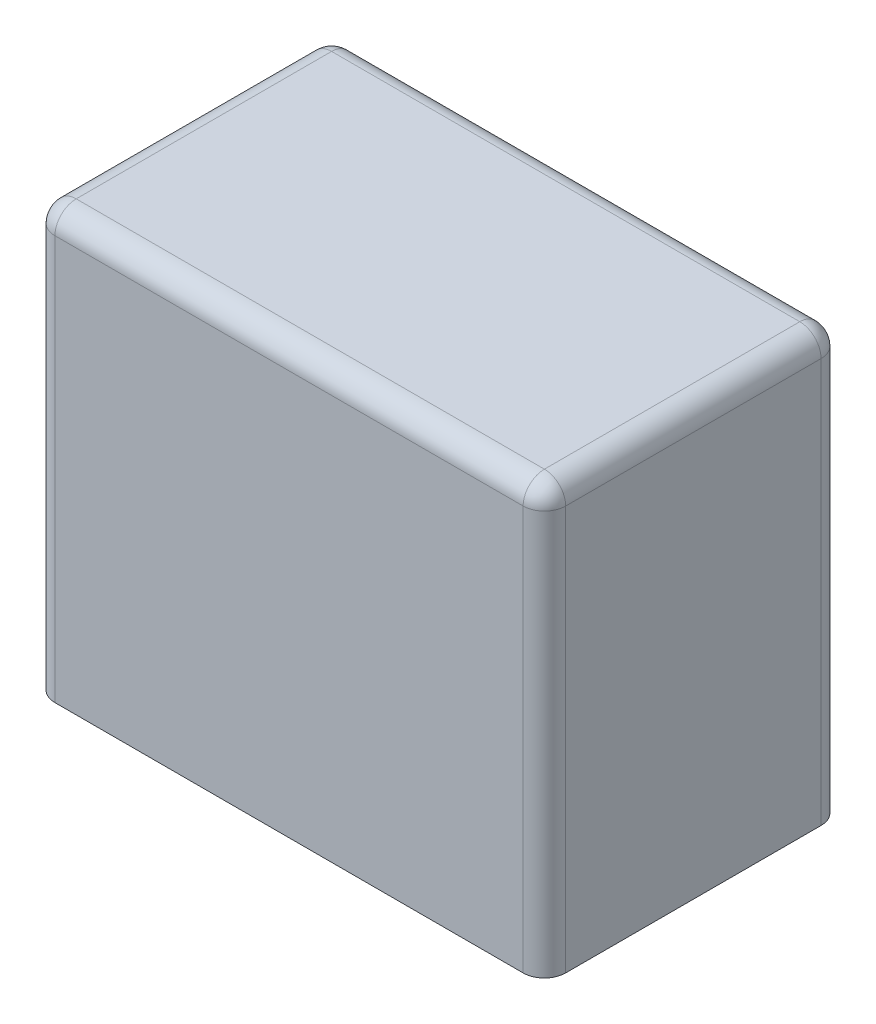
ISO-10303-21;
HEADER;
FILE_DESCRIPTION(('STEP AP214'),'2;1');
FILE_NAME('part.step','',(''),(''),'','','');
FILE_SCHEMA(('AUTOMOTIVE_DESIGN { 1 0 10303 214 1 1 1 1 }'));
ENDSEC;
DATA;
#1=APPLICATION_CONTEXT('core data for automotive mechanical design processes');
#2=APPLICATION_PROTOCOL_DEFINITION('international standard','automotive_design',2000,#1);
#3=PRODUCT_CONTEXT('',#1,'mechanical');
#4=PRODUCT('Part','Part','',(#3));
#5=PRODUCT_RELATED_PRODUCT_CATEGORY('part','',(#4));
#6=PRODUCT_DEFINITION_FORMATION('','',#4);
#7=PRODUCT_DEFINITION_CONTEXT('part definition',#1,'design');
#8=PRODUCT_DEFINITION('design','',#6,#7);
#9=PRODUCT_DEFINITION_SHAPE('','',#8);
#10=(LENGTH_UNIT() NAMED_UNIT(*) SI_UNIT(.MILLI.,.METRE.));
#11=(NAMED_UNIT(*) PLANE_ANGLE_UNIT() SI_UNIT($,.RADIAN.));
#12=(NAMED_UNIT(*) SI_UNIT($,.STERADIAN.) SOLID_ANGLE_UNIT());
#13=UNCERTAINTY_MEASURE_WITH_UNIT(LENGTH_MEASURE(1.E-05),#10,'distance_accuracy_value','');
#14=(GEOMETRIC_REPRESENTATION_CONTEXT(3) GLOBAL_UNCERTAINTY_ASSIGNED_CONTEXT((#13)) GLOBAL_UNIT_ASSIGNED_CONTEXT((#10,
#11,#12)) REPRESENTATION_CONTEXT('',''));
#15=CARTESIAN_POINT('',(0.,0.,0.));
#16=DIRECTION('',(0.,0.,1.));
#17=DIRECTION('',(1.,0.,0.));
#18=AXIS2_PLACEMENT_3D('',#15,#16,#17);
#19=CARTESIAN_POINT('',(12.,20.,7.));
#20=DIRECTION('',(-1.,0.,0.));
#21=DIRECTION('',(0.,0.,1.));
#22=AXIS2_PLACEMENT_3D('',#19,#20,#21);
#23=PLANE('',#22);
#24=DIRECTION('',(0.,0.,-1.));
#25=VECTOR('',#24,1.);
#26=CARTESIAN_POINT('',(12.,0.,7.));
#27=LINE('',#26,#25);
#28=CARTESIAN_POINT('',(12.,0.,6.));
#29=VERTEX_POINT('',#28);
#30=CARTESIAN_POINT('',(12.,0.,-6.));
#31=VERTEX_POINT('',#30);
#32=EDGE_CURVE('E208',#29,#31,#27,.T.);
#33=ORIENTED_EDGE('',*,*,#32,.T.);
#34=DIRECTION('',(0.,-1.,0.));
#35=VECTOR('',#34,1.);
#36=CARTESIAN_POINT('',(12.,20.,-6.));
#37=LINE('',#36,#35);
#38=CARTESIAN_POINT('',(12.,19.,-6.));
#39=VERTEX_POINT('',#38);
#40=EDGE_CURVE('E60',#31,#39,#37,.F.);
#41=ORIENTED_EDGE('',*,*,#40,.T.);
#42=DIRECTION('',(0.,0.,-1.));
#43=VECTOR('',#42,1.);
#44=CARTESIAN_POINT('',(12.,19.,7.));
#45=LINE('',#44,#43);
#46=CARTESIAN_POINT('',(12.,19.,6.));
#47=VERTEX_POINT('',#46);
#48=EDGE_CURVE('E65',#39,#47,#45,.F.);
#49=ORIENTED_EDGE('',*,*,#48,.T.);
#50=DIRECTION('',(0.,-1.,0.));
#51=VECTOR('',#50,1.);
#52=CARTESIAN_POINT('',(12.,20.,6.));
#53=LINE('',#52,#51);
#54=EDGE_CURVE('E177',#47,#29,#53,.T.);
#55=ORIENTED_EDGE('',*,*,#54,.T.);
#56=EDGE_LOOP('',(#33,#41,#49,#55));
#57=FACE_BOUND('',#56,.T.);
#58=ADVANCED_FACE('F43',(#57),#23,.F.);
#59=CARTESIAN_POINT('',(-12.,20.,-7.));
#60=DIRECTION('',(0.,0.,1.));
#61=DIRECTION('',(1.,0.,0.));
#62=AXIS2_PLACEMENT_3D('',#59,#60,#61);
#63=PLANE('',#62);
#64=DIRECTION('',(-1.,0.,0.));
#65=VECTOR('',#64,1.);
#66=CARTESIAN_POINT('',(-12.,0.,-7.));
#67=LINE('',#66,#65);
#68=CARTESIAN_POINT('',(11.,0.,-7.));
#69=VERTEX_POINT('',#68);
#70=CARTESIAN_POINT('',(-11.,0.,-7.));
#71=VERTEX_POINT('',#70);
#72=EDGE_CURVE('E210',#69,#71,#67,.T.);
#73=ORIENTED_EDGE('',*,*,#72,.T.);
#74=DIRECTION('',(0.,-1.,0.));
#75=VECTOR('',#74,1.);
#76=CARTESIAN_POINT('',(-11.,20.,-7.));
#77=LINE('',#76,#75);
#78=CARTESIAN_POINT('',(-11.,19.,-7.));
#79=VERTEX_POINT('',#78);
#80=EDGE_CURVE('E175',#71,#79,#77,.F.);
#81=ORIENTED_EDGE('',*,*,#80,.T.);
#82=DIRECTION('',(-1.,0.,0.));
#83=VECTOR('',#82,1.);
#84=CARTESIAN_POINT('',(-12.,19.,-7.));
#85=LINE('',#84,#83);
#86=CARTESIAN_POINT('',(11.,19.,-7.));
#87=VERTEX_POINT('',#86);
#88=EDGE_CURVE('E173',#79,#87,#85,.F.);
#89=ORIENTED_EDGE('',*,*,#88,.T.);
#90=DIRECTION('',(0.,-1.,0.));
#91=VECTOR('',#90,1.);
#92=CARTESIAN_POINT('',(11.,20.,-7.));
#93=LINE('',#92,#91);
#94=EDGE_CURVE('E171',#87,#69,#93,.T.);
#95=ORIENTED_EDGE('',*,*,#94,.T.);
#96=EDGE_LOOP('',(#73,#81,#89,#95));
#97=FACE_BOUND('',#96,.T.);
#98=ADVANCED_FACE('F263',(#97),#63,.F.);
#99=CARTESIAN_POINT('',(-12.,20.,7.));
#100=DIRECTION('',(1.,0.,0.));
#101=DIRECTION('',(0.,0.,-1.));
#102=AXIS2_PLACEMENT_3D('',#99,#100,#101);
#103=PLANE('',#102);
#104=DIRECTION('',(0.,0.,1.));
#105=VECTOR('',#104,1.);
#106=CARTESIAN_POINT('',(-12.,19.,7.));
#107=LINE('',#106,#105);
#108=CARTESIAN_POINT('',(-12.,19.,6.));
#109=VERTEX_POINT('',#108);
#110=CARTESIAN_POINT('',(-12.,19.,-6.));
#111=VERTEX_POINT('',#110);
#112=EDGE_CURVE('E167',#109,#111,#107,.F.);
#113=ORIENTED_EDGE('',*,*,#112,.T.);
#114=DIRECTION('',(0.,-1.,0.));
#115=VECTOR('',#114,1.);
#116=CARTESIAN_POINT('',(-12.,20.,-6.));
#117=LINE('',#116,#115);
#118=CARTESIAN_POINT('',(-12.,0.,-6.));
#119=VERTEX_POINT('',#118);
#120=EDGE_CURVE('E169',#111,#119,#117,.T.);
#121=ORIENTED_EDGE('',*,*,#120,.T.);
#122=DIRECTION('',(0.,0.,1.));
#123=VECTOR('',#122,1.);
#124=CARTESIAN_POINT('',(-12.,0.,7.));
#125=LINE('',#124,#123);
#126=CARTESIAN_POINT('',(-12.,0.,6.));
#127=VERTEX_POINT('',#126);
#128=EDGE_CURVE('E214',#119,#127,#125,.T.);
#129=ORIENTED_EDGE('',*,*,#128,.T.);
#130=DIRECTION('',(0.,-1.,0.));
#131=VECTOR('',#130,1.);
#132=CARTESIAN_POINT('',(-12.,20.,6.));
#133=LINE('',#132,#131);
#134=EDGE_CURVE('E165',#127,#109,#133,.F.);
#135=ORIENTED_EDGE('',*,*,#134,.T.);
#136=EDGE_LOOP('',(#113,#121,#129,#135));
#137=FACE_BOUND('',#136,.T.);
#138=ADVANCED_FACE('F268',(#137),#103,.F.);
#139=CARTESIAN_POINT('',(-12.,20.,7.));
#140=DIRECTION('',(0.,0.,-1.));
#141=DIRECTION('',(-1.,0.,0.));
#142=AXIS2_PLACEMENT_3D('',#139,#140,#141);
#143=PLANE('',#142);
#144=DIRECTION('',(1.,0.,0.));
#145=VECTOR('',#144,1.);
#146=CARTESIAN_POINT('',(-12.,0.,7.));
#147=LINE('',#146,#145);
#148=CARTESIAN_POINT('',(-11.,0.,7.));
#149=VERTEX_POINT('',#148);
#150=CARTESIAN_POINT('',(11.,0.,7.));
#151=VERTEX_POINT('',#150);
#152=EDGE_CURVE('E150',#149,#151,#147,.T.);
#153=ORIENTED_EDGE('',*,*,#152,.T.);
#154=DIRECTION('',(0.,-1.,0.));
#155=VECTOR('',#154,1.);
#156=CARTESIAN_POINT('',(11.,20.,7.));
#157=LINE('',#156,#155);
#158=CARTESIAN_POINT('',(11.,19.,7.));
#159=VERTEX_POINT('',#158);
#160=EDGE_CURVE('E163',#151,#159,#157,.F.);
#161=ORIENTED_EDGE('',*,*,#160,.T.);
#162=DIRECTION('',(1.,0.,0.));
#163=VECTOR('',#162,1.);
#164=CARTESIAN_POINT('',(-12.,19.,7.));
#165=LINE('',#164,#163);
#166=CARTESIAN_POINT('',(-11.,19.,7.));
#167=VERTEX_POINT('',#166);
#168=EDGE_CURVE('E128',#159,#167,#165,.F.);
#169=ORIENTED_EDGE('',*,*,#168,.T.);
#170=DIRECTION('',(0.,-1.,0.));
#171=VECTOR('',#170,1.);
#172=CARTESIAN_POINT('',(-11.,20.,7.));
#173=LINE('',#172,#171);
#174=EDGE_CURVE('E156',#167,#149,#173,.T.);
#175=ORIENTED_EDGE('',*,*,#174,.T.);
#176=EDGE_LOOP('',(#153,#161,#169,#175));
#177=FACE_BOUND('',#176,.T.);
#178=ADVANCED_FACE('F239',(#177),#143,.F.);
#179=CARTESIAN_POINT('',(0.,20.,0.));
#180=DIRECTION('',(0.,-1.,0.));
#181=DIRECTION('',(0.,0.,-1.));
#182=AXIS2_PLACEMENT_3D('',#179,#180,#181);
#183=PLANE('',#182);
#184=DIRECTION('',(0.,0.,1.));
#185=VECTOR('',#184,1.);
#186=CARTESIAN_POINT('',(-11.,20.,0.));
#187=LINE('',#186,#185);
#188=CARTESIAN_POINT('',(-11.,20.,-6.));
#189=VERTEX_POINT('',#188);
#190=CARTESIAN_POINT('',(-11.,20.,6.));
#191=VERTEX_POINT('',#190);
#192=EDGE_CURVE('E154',#189,#191,#187,.T.);
#193=ORIENTED_EDGE('',*,*,#192,.T.);
#194=DIRECTION('',(1.,0.,0.));
#195=VECTOR('',#194,1.);
#196=CARTESIAN_POINT('',(0.,20.,6.));
#197=LINE('',#196,#195);
#198=CARTESIAN_POINT('',(11.,20.,6.));
#199=VERTEX_POINT('',#198);
#200=EDGE_CURVE('E126',#191,#199,#197,.T.);
#201=ORIENTED_EDGE('',*,*,#200,.T.);
#202=DIRECTION('',(0.,0.,-1.));
#203=VECTOR('',#202,1.);
#204=CARTESIAN_POINT('',(11.,20.,0.));
#205=LINE('',#204,#203);
#206=CARTESIAN_POINT('',(11.,20.,-6.));
#207=VERTEX_POINT('',#206);
#208=EDGE_CURVE('E143',#199,#207,#205,.T.);
#209=ORIENTED_EDGE('',*,*,#208,.T.);
#210=DIRECTION('',(-1.,0.,0.));
#211=VECTOR('',#210,1.);
#212=CARTESIAN_POINT('',(0.,20.,-6.));
#213=LINE('',#212,#211);
#214=EDGE_CURVE('E149',#207,#189,#213,.T.);
#215=ORIENTED_EDGE('',*,*,#214,.T.);
#216=EDGE_LOOP('',(#193,#201,#209,#215));
#217=FACE_BOUND('',#216,.T.);
#218=ADVANCED_FACE('F152',(#217),#183,.F.);
#219=CARTESIAN_POINT('',(0.,0.,0.));
#220=DIRECTION('',(0.,-1.,0.));
#221=DIRECTION('',(0.,0.,-1.));
#222=AXIS2_PLACEMENT_3D('',#219,#220,#221);
#223=PLANE('',#222);
#224=ORIENTED_EDGE('',*,*,#128,.F.);
#225=CARTESIAN_POINT('',(-11.,0.,-6.));
#226=DIRECTION('',(0.,-1.,0.));
#227=DIRECTION('',(0.,0.,-1.));
#228=AXIS2_PLACEMENT_3D('',#225,#226,#227);
#229=CIRCLE('',#228,1.);
#230=EDGE_CURVE('E11',#119,#71,#229,.T.);
#231=ORIENTED_EDGE('',*,*,#230,.T.);
#232=ORIENTED_EDGE('',*,*,#72,.F.);
#233=CARTESIAN_POINT('',(11.,0.,-6.));
#234=DIRECTION('',(0.,-1.,0.));
#235=DIRECTION('',(0.,0.,-1.));
#236=AXIS2_PLACEMENT_3D('',#233,#234,#235);
#237=CIRCLE('',#236,1.);
#238=EDGE_CURVE('E52',#69,#31,#237,.T.);
#239=ORIENTED_EDGE('',*,*,#238,.T.);
#240=ORIENTED_EDGE('',*,*,#32,.F.);
#241=CARTESIAN_POINT('',(11.,0.,6.));
#242=DIRECTION('',(0.,-1.,0.));
#243=DIRECTION('',(0.,0.,-1.));
#244=AXIS2_PLACEMENT_3D('',#241,#242,#243);
#245=CIRCLE('',#244,1.);
#246=EDGE_CURVE('E183',#29,#151,#245,.T.);
#247=ORIENTED_EDGE('',*,*,#246,.T.);
#248=ORIENTED_EDGE('',*,*,#152,.F.);
#249=CARTESIAN_POINT('',(-11.,0.,6.));
#250=DIRECTION('',(0.,-1.,0.));
#251=DIRECTION('',(0.,0.,-1.));
#252=AXIS2_PLACEMENT_3D('',#249,#250,#251);
#253=CIRCLE('',#252,1.);
#254=EDGE_CURVE('E181',#149,#127,#253,.T.);
#255=ORIENTED_EDGE('',*,*,#254,.T.);
#256=EDGE_LOOP('',(#224,#231,#232,#239,#240,#247,#248,#255));
#257=FACE_BOUND('',#256,.T.);
#258=ADVANCED_FACE('F246',(#257),#223,.T.);
#259=CARTESIAN_POINT('',(-11.,20.,-6.));
#260=DIRECTION('',(0.,-1.,0.));
#261=DIRECTION('',(0.,0.,-1.));
#262=AXIS2_PLACEMENT_3D('',#259,#260,#261);
#263=CYLINDRICAL_SURFACE('',#262,1.);
#264=ORIENTED_EDGE('',*,*,#230,.F.);
#265=ORIENTED_EDGE('',*,*,#120,.F.);
#266=CARTESIAN_POINT('',(-11.,19.,-6.));
#267=DIRECTION('',(0.,1.,0.));
#268=DIRECTION('',(0.,0.,1.));
#269=AXIS2_PLACEMENT_3D('',#266,#267,#268);
#270=CIRCLE('',#269,1.);
#271=EDGE_CURVE('E47',#79,#111,#270,.T.);
#272=ORIENTED_EDGE('',*,*,#271,.F.);
#273=ORIENTED_EDGE('',*,*,#80,.F.);
#274=EDGE_LOOP('',(#264,#265,#272,#273));
#275=FACE_BOUND('',#274,.T.);
#276=ADVANCED_FACE('F45',(#275),#263,.T.);
#277=CARTESIAN_POINT('',(0.,19.,-6.));
#278=DIRECTION('',(-1.,0.,0.));
#279=DIRECTION('',(0.,0.,1.));
#280=AXIS2_PLACEMENT_3D('',#277,#278,#279);
#281=CYLINDRICAL_SURFACE('',#280,1.);
#282=CARTESIAN_POINT('',(11.,19.,-6.));
#283=DIRECTION('',(1.,0.,0.));
#284=DIRECTION('',(0.,0.,-1.));
#285=AXIS2_PLACEMENT_3D('',#282,#283,#284);
#286=CIRCLE('',#285,1.);
#287=EDGE_CURVE('E200',#87,#207,#286,.T.);
#288=ORIENTED_EDGE('',*,*,#287,.F.);
#289=ORIENTED_EDGE('',*,*,#88,.F.);
#290=CARTESIAN_POINT('',(-11.,19.,-6.));
#291=DIRECTION('',(-1.,0.,0.));
#292=DIRECTION('',(0.,0.,1.));
#293=AXIS2_PLACEMENT_3D('',#290,#291,#292);
#294=CIRCLE('',#293,1.);
#295=EDGE_CURVE('E202',#189,#79,#294,.T.);
#296=ORIENTED_EDGE('',*,*,#295,.F.);
#297=ORIENTED_EDGE('',*,*,#214,.F.);
#298=EDGE_LOOP('',(#288,#289,#296,#297));
#299=FACE_BOUND('',#298,.T.);
#300=ADVANCED_FACE('F223',(#299),#281,.T.);
#301=CARTESIAN_POINT('',(11.,20.,-6.));
#302=DIRECTION('',(0.,-1.,0.));
#303=DIRECTION('',(0.,0.,-1.));
#304=AXIS2_PLACEMENT_3D('',#301,#302,#303);
#305=CYLINDRICAL_SURFACE('',#304,1.);
#306=ORIENTED_EDGE('',*,*,#238,.F.);
#307=ORIENTED_EDGE('',*,*,#94,.F.);
#308=CARTESIAN_POINT('',(11.,19.,-6.));
#309=DIRECTION('',(0.,1.,0.));
#310=DIRECTION('',(0.,0.,1.));
#311=AXIS2_PLACEMENT_3D('',#308,#309,#310);
#312=CIRCLE('',#311,1.);
#313=EDGE_CURVE('E197',#39,#87,#312,.T.);
#314=ORIENTED_EDGE('',*,*,#313,.F.);
#315=ORIENTED_EDGE('',*,*,#40,.F.);
#316=EDGE_LOOP('',(#306,#307,#314,#315));
#317=FACE_BOUND('',#316,.T.);
#318=ADVANCED_FACE('F251',(#317),#305,.T.);
#319=CARTESIAN_POINT('',(-11.,19.,-6.));
#320=DIRECTION('',(0.,0.,-1.));
#321=DIRECTION('',(-1.,0.,0.));
#322=AXIS2_PLACEMENT_3D('',#319,#320,#321);
#323=SPHERICAL_SURFACE('',#322,1.);
#324=ORIENTED_EDGE('',*,*,#295,.T.);
#325=ORIENTED_EDGE('',*,*,#271,.T.);
#326=CARTESIAN_POINT('',(-11.,19.,-6.));
#327=DIRECTION('',(0.,0.,-1.));
#328=DIRECTION('',(0.,1.,0.));
#329=AXIS2_PLACEMENT_3D('',#326,#327,#328);
#330=CIRCLE('',#329,1.);
#331=EDGE_CURVE('E194',#189,#111,#330,.F.);
#332=ORIENTED_EDGE('',*,*,#331,.F.);
#333=EDGE_LOOP('',(#324,#325,#332));
#334=FACE_BOUND('',#333,.T.);
#335=ADVANCED_FACE('F224',(#334),#323,.T.);
#336=CARTESIAN_POINT('',(11.,19.,-6.));
#337=DIRECTION('',(0.,0.,-1.));
#338=DIRECTION('',(-1.,0.,0.));
#339=AXIS2_PLACEMENT_3D('',#336,#337,#338);
#340=SPHERICAL_SURFACE('',#339,1.);
#341=ORIENTED_EDGE('',*,*,#313,.T.);
#342=ORIENTED_EDGE('',*,*,#287,.T.);
#343=CARTESIAN_POINT('',(11.,19.,-6.));
#344=DIRECTION('',(0.,0.,-1.));
#345=DIRECTION('',(-1.,0.,0.));
#346=AXIS2_PLACEMENT_3D('',#343,#344,#345);
#347=CIRCLE('',#346,1.);
#348=EDGE_CURVE('E146',#39,#207,#347,.F.);
#349=ORIENTED_EDGE('',*,*,#348,.F.);
#350=EDGE_LOOP('',(#341,#342,#349));
#351=FACE_BOUND('',#350,.T.);
#352=ADVANCED_FACE('F253',(#351),#340,.T.);
#353=CARTESIAN_POINT('',(-11.,20.,6.));
#354=DIRECTION('',(0.,-1.,0.));
#355=DIRECTION('',(0.,0.,-1.));
#356=AXIS2_PLACEMENT_3D('',#353,#354,#355);
#357=CYLINDRICAL_SURFACE('',#356,1.);
#358=ORIENTED_EDGE('',*,*,#254,.F.);
#359=ORIENTED_EDGE('',*,*,#174,.F.);
#360=CARTESIAN_POINT('',(-11.,19.,6.));
#361=DIRECTION('',(0.,1.,0.));
#362=DIRECTION('',(0.,0.,1.));
#363=AXIS2_PLACEMENT_3D('',#360,#361,#362);
#364=CIRCLE('',#363,1.);
#365=EDGE_CURVE('E190',#109,#167,#364,.T.);
#366=ORIENTED_EDGE('',*,*,#365,.F.);
#367=ORIENTED_EDGE('',*,*,#134,.F.);
#368=EDGE_LOOP('',(#358,#359,#366,#367));
#369=FACE_BOUND('',#368,.T.);
#370=ADVANCED_FACE('F236',(#369),#357,.T.);
#371=CARTESIAN_POINT('',(-11.,19.,0.));
#372=DIRECTION('',(0.,0.,1.));
#373=DIRECTION('',(1.,0.,0.));
#374=AXIS2_PLACEMENT_3D('',#371,#372,#373);
#375=CYLINDRICAL_SURFACE('',#374,1.);
#376=ORIENTED_EDGE('',*,*,#331,.T.);
#377=ORIENTED_EDGE('',*,*,#112,.F.);
#378=CARTESIAN_POINT('',(-11.,19.,6.));
#379=DIRECTION('',(0.,0.,1.));
#380=DIRECTION('',(1.,0.,0.));
#381=AXIS2_PLACEMENT_3D('',#378,#379,#380);
#382=CIRCLE('',#381,1.);
#383=EDGE_CURVE('E140',#191,#109,#382,.T.);
#384=ORIENTED_EDGE('',*,*,#383,.F.);
#385=ORIENTED_EDGE('',*,*,#192,.F.);
#386=EDGE_LOOP('',(#376,#377,#384,#385));
#387=FACE_BOUND('',#386,.T.);
#388=ADVANCED_FACE('F227',(#387),#375,.T.);
#389=CARTESIAN_POINT('',(11.,19.,0.));
#390=DIRECTION('',(0.,0.,-1.));
#391=DIRECTION('',(-1.,0.,0.));
#392=AXIS2_PLACEMENT_3D('',#389,#390,#391);
#393=CYLINDRICAL_SURFACE('',#392,1.);
#394=ORIENTED_EDGE('',*,*,#348,.T.);
#395=ORIENTED_EDGE('',*,*,#208,.F.);
#396=CARTESIAN_POINT('',(11.,19.,6.));
#397=DIRECTION('',(0.,0.,1.));
#398=DIRECTION('',(1.,0.,0.));
#399=AXIS2_PLACEMENT_3D('',#396,#397,#398);
#400=CIRCLE('',#399,1.);
#401=EDGE_CURVE('E134',#47,#199,#400,.T.);
#402=ORIENTED_EDGE('',*,*,#401,.F.);
#403=ORIENTED_EDGE('',*,*,#48,.F.);
#404=EDGE_LOOP('',(#394,#395,#402,#403));
#405=FACE_BOUND('',#404,.T.);
#406=ADVANCED_FACE('F144',(#405),#393,.T.);
#407=CARTESIAN_POINT('',(11.,20.,6.));
#408=DIRECTION('',(0.,-1.,0.));
#409=DIRECTION('',(0.,0.,-1.));
#410=AXIS2_PLACEMENT_3D('',#407,#408,#409);
#411=CYLINDRICAL_SURFACE('',#410,1.);
#412=ORIENTED_EDGE('',*,*,#246,.F.);
#413=ORIENTED_EDGE('',*,*,#54,.F.);
#414=CARTESIAN_POINT('',(11.,19.,6.));
#415=DIRECTION('',(0.,1.,0.));
#416=DIRECTION('',(0.,0.,1.));
#417=AXIS2_PLACEMENT_3D('',#414,#415,#416);
#418=CIRCLE('',#417,1.);
#419=EDGE_CURVE('E138',#159,#47,#418,.T.);
#420=ORIENTED_EDGE('',*,*,#419,.F.);
#421=ORIENTED_EDGE('',*,*,#160,.F.);
#422=EDGE_LOOP('',(#412,#413,#420,#421));
#423=FACE_BOUND('',#422,.T.);
#424=ADVANCED_FACE('F243',(#423),#411,.T.);
#425=CARTESIAN_POINT('',(-11.,19.,6.));
#426=DIRECTION('',(-1.,0.,0.));
#427=DIRECTION('',(0.,0.,1.));
#428=AXIS2_PLACEMENT_3D('',#425,#426,#427);
#429=SPHERICAL_SURFACE('',#428,1.);
#430=ORIENTED_EDGE('',*,*,#383,.T.);
#431=ORIENTED_EDGE('',*,*,#365,.T.);
#432=CARTESIAN_POINT('',(-11.,19.,6.));
#433=DIRECTION('',(-1.,0.,0.));
#434=DIRECTION('',(0.,0.,1.));
#435=AXIS2_PLACEMENT_3D('',#432,#433,#434);
#436=CIRCLE('',#435,1.);
#437=EDGE_CURVE('E131',#191,#167,#436,.F.);
#438=ORIENTED_EDGE('',*,*,#437,.F.);
#439=EDGE_LOOP('',(#430,#431,#438));
#440=FACE_BOUND('',#439,.T.);
#441=ADVANCED_FACE('F231',(#440),#429,.T.);
#442=CARTESIAN_POINT('',(11.,19.,6.));
#443=DIRECTION('',(1.,0.,0.));
#444=DIRECTION('',(0.,0.,-1.));
#445=AXIS2_PLACEMENT_3D('',#442,#443,#444);
#446=SPHERICAL_SURFACE('',#445,1.);
#447=ORIENTED_EDGE('',*,*,#419,.T.);
#448=ORIENTED_EDGE('',*,*,#401,.T.);
#449=CARTESIAN_POINT('',(11.,19.,6.));
#450=DIRECTION('',(1.,0.,0.));
#451=DIRECTION('',(0.,0.,-1.));
#452=AXIS2_PLACEMENT_3D('',#449,#450,#451);
#453=CIRCLE('',#452,1.);
#454=EDGE_CURVE('E122',#159,#199,#453,.F.);
#455=ORIENTED_EDGE('',*,*,#454,.F.);
#456=EDGE_LOOP('',(#447,#448,#455));
#457=FACE_BOUND('',#456,.T.);
#458=ADVANCED_FACE('F136',(#457),#446,.T.);
#459=CARTESIAN_POINT('',(0.,19.,6.));
#460=DIRECTION('',(1.,0.,0.));
#461=DIRECTION('',(0.,0.,-1.));
#462=AXIS2_PLACEMENT_3D('',#459,#460,#461);
#463=CYLINDRICAL_SURFACE('',#462,1.);
#464=ORIENTED_EDGE('',*,*,#437,.T.);
#465=ORIENTED_EDGE('',*,*,#168,.F.);
#466=ORIENTED_EDGE('',*,*,#454,.T.);
#467=ORIENTED_EDGE('',*,*,#200,.F.);
#468=EDGE_LOOP('',(#464,#465,#466,#467));
#469=FACE_BOUND('',#468,.T.);
#470=ADVANCED_FACE('F124',(#469),#463,.T.);
#471=CLOSED_SHELL('',(#58,#98,#138,#178,#218,#258,#276,#300,#318,#335,#352,#370,#388,#406,#424,
#441,#458,#470));
#472=MANIFOLD_SOLID_BREP('B2',#471);
#473=ADVANCED_BREP_SHAPE_REPRESENTATION('',(#18,#472),#14);
#474=SHAPE_DEFINITION_REPRESENTATION(#9,#473);
ENDSEC;
END-ISO-10303-21;
